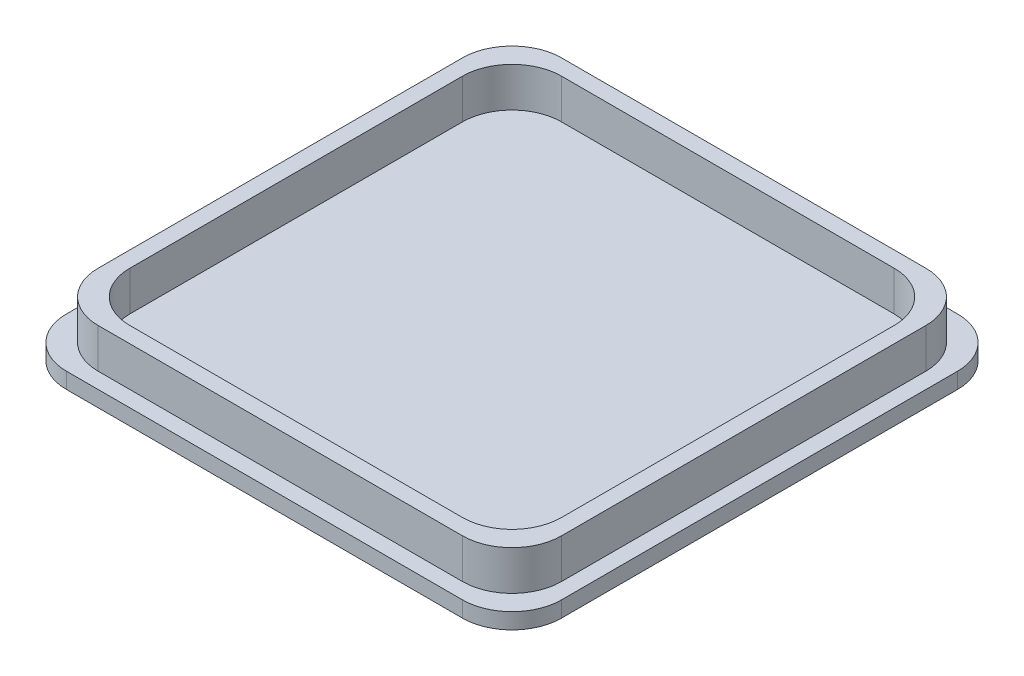
ISO-10303-21;
HEADER;
FILE_DESCRIPTION(('STEP AP214'),'2;1');
FILE_NAME('part.step','',(''),(''),'','','');
FILE_SCHEMA(('AUTOMOTIVE_DESIGN { 1 0 10303 214 1 1 1 1 }'));
ENDSEC;
DATA;
#1=APPLICATION_CONTEXT('core data for automotive mechanical design processes');
#2=APPLICATION_PROTOCOL_DEFINITION('international standard','automotive_design',2000,#1);
#3=PRODUCT_CONTEXT('',#1,'mechanical');
#4=PRODUCT('Part','Part','',(#3));
#5=PRODUCT_RELATED_PRODUCT_CATEGORY('part','',(#4));
#6=PRODUCT_DEFINITION_FORMATION('','',#4);
#7=PRODUCT_DEFINITION_CONTEXT('part definition',#1,'design');
#8=PRODUCT_DEFINITION('design','',#6,#7);
#9=PRODUCT_DEFINITION_SHAPE('','',#8);
#10=(LENGTH_UNIT() NAMED_UNIT(*) SI_UNIT(.MILLI.,.METRE.));
#11=(NAMED_UNIT(*) PLANE_ANGLE_UNIT() SI_UNIT($,.RADIAN.));
#12=(NAMED_UNIT(*) SI_UNIT($,.STERADIAN.) SOLID_ANGLE_UNIT());
#13=UNCERTAINTY_MEASURE_WITH_UNIT(LENGTH_MEASURE(1.E-05),#10,'distance_accuracy_value','');
#14=(GEOMETRIC_REPRESENTATION_CONTEXT(3) GLOBAL_UNCERTAINTY_ASSIGNED_CONTEXT((#13)) GLOBAL_UNIT_ASSIGNED_CONTEXT((#10,
#11,#12)) REPRESENTATION_CONTEXT('',''));
#15=CARTESIAN_POINT('',(0.,0.,0.));
#16=DIRECTION('',(0.,0.,1.));
#17=DIRECTION('',(1.,0.,0.));
#18=AXIS2_PLACEMENT_3D('',#15,#16,#17);
#19=CARTESIAN_POINT('',(0.,1.6,0.));
#20=DIRECTION('',(0.,-1.,0.));
#21=DIRECTION('',(0.,0.,-1.));
#22=AXIS2_PLACEMENT_3D('',#19,#20,#21);
#23=PLANE('',#22);
#24=DIRECTION('',(-1.,0.,0.));
#25=VECTOR('',#24,1.);
#26=CARTESIAN_POINT('',(-25.,1.6,-25.));
#27=LINE('',#26,#25);
#28=CARTESIAN_POINT('',(20.,1.6,-25.));
#29=VERTEX_POINT('',#28);
#30=CARTESIAN_POINT('',(-20.,1.6,-25.));
#31=VERTEX_POINT('',#30);
#32=EDGE_CURVE('E364',#29,#31,#27,.T.);
#33=ORIENTED_EDGE('',*,*,#32,.T.);
#34=CARTESIAN_POINT('',(-20.,1.6,-20.));
#35=DIRECTION('',(0.,-1.,0.));
#36=DIRECTION('',(0.,0.,-1.));
#37=AXIS2_PLACEMENT_3D('',#34,#35,#36);
#38=CIRCLE('',#37,5.);
#39=CARTESIAN_POINT('',(-25.,1.6,-20.));
#40=VERTEX_POINT('',#39);
#41=EDGE_CURVE('E248',#31,#40,#38,.F.);
#42=ORIENTED_EDGE('',*,*,#41,.T.);
#43=DIRECTION('',(0.,0.,1.));
#44=VECTOR('',#43,1.);
#45=CARTESIAN_POINT('',(-25.,1.6,25.));
#46=LINE('',#45,#44);
#47=CARTESIAN_POINT('',(-25.,1.6,20.));
#48=VERTEX_POINT('',#47);
#49=EDGE_CURVE('E217',#40,#48,#46,.T.);
#50=ORIENTED_EDGE('',*,*,#49,.T.);
#51=CARTESIAN_POINT('',(-20.,1.6,20.));
#52=DIRECTION('',(0.,-1.,0.));
#53=DIRECTION('',(0.,0.,-1.));
#54=AXIS2_PLACEMENT_3D('',#51,#52,#53);
#55=CIRCLE('',#54,5.);
#56=CARTESIAN_POINT('',(-20.,1.6,25.));
#57=VERTEX_POINT('',#56);
#58=EDGE_CURVE('E246',#48,#57,#55,.F.);
#59=ORIENTED_EDGE('',*,*,#58,.T.);
#60=DIRECTION('',(1.,0.,0.));
#61=VECTOR('',#60,1.);
#62=CARTESIAN_POINT('',(-25.,1.6,25.));
#63=LINE('',#62,#61);
#64=CARTESIAN_POINT('',(20.,1.6,25.));
#65=VERTEX_POINT('',#64);
#66=EDGE_CURVE('E233',#57,#65,#63,.T.);
#67=ORIENTED_EDGE('',*,*,#66,.T.);
#68=CARTESIAN_POINT('',(20.,1.6,20.));
#69=DIRECTION('',(0.,-1.,0.));
#70=DIRECTION('',(0.,0.,-1.));
#71=AXIS2_PLACEMENT_3D('',#68,#69,#70);
#72=CIRCLE('',#71,5.);
#73=CARTESIAN_POINT('',(25.,1.6,20.));
#74=VERTEX_POINT('',#73);
#75=EDGE_CURVE('E244',#65,#74,#72,.F.);
#76=ORIENTED_EDGE('',*,*,#75,.T.);
#77=DIRECTION('',(0.,0.,-1.));
#78=VECTOR('',#77,1.);
#79=CARTESIAN_POINT('',(25.,1.6,25.));
#80=LINE('',#79,#78);
#81=CARTESIAN_POINT('',(25.,1.6,-20.));
#82=VERTEX_POINT('',#81);
#83=EDGE_CURVE('E227',#74,#82,#80,.T.);
#84=ORIENTED_EDGE('',*,*,#83,.T.);
#85=CARTESIAN_POINT('',(20.,1.6,-20.));
#86=DIRECTION('',(0.,-1.,0.));
#87=DIRECTION('',(0.,0.,-1.));
#88=AXIS2_PLACEMENT_3D('',#85,#86,#87);
#89=CIRCLE('',#88,5.);
#90=EDGE_CURVE('E242',#82,#29,#89,.F.);
#91=ORIENTED_EDGE('',*,*,#90,.T.);
#92=EDGE_LOOP('',(#33,#42,#50,#59,#67,#76,#84,#91));
#93=FACE_BOUND('',#92,.T.);
#94=DIRECTION('',(1.,0.,0.));
#95=VECTOR('',#94,1.);
#96=CARTESIAN_POINT('',(-23.4,1.6,23.4));
#97=LINE('',#96,#95);
#98=CARTESIAN_POINT('',(-18.4,1.6,23.4));
#99=VERTEX_POINT('',#98);
#100=CARTESIAN_POINT('',(18.4,1.6,23.4));
#101=VERTEX_POINT('',#100);
#102=EDGE_CURVE('E329',#99,#101,#97,.T.);
#103=ORIENTED_EDGE('',*,*,#102,.F.);
#104=CARTESIAN_POINT('',(-18.4,1.6,18.4));
#105=DIRECTION('',(0.,-1.,0.));
#106=DIRECTION('',(0.,0.,-1.));
#107=AXIS2_PLACEMENT_3D('',#104,#105,#106);
#108=CIRCLE('',#107,5.);
#109=CARTESIAN_POINT('',(-23.4,1.6,18.4));
#110=VERTEX_POINT('',#109);
#111=EDGE_CURVE('E324',#99,#110,#108,.T.);
#112=ORIENTED_EDGE('',*,*,#111,.T.);
#113=DIRECTION('',(0.,0.,1.));
#114=VECTOR('',#113,1.);
#115=CARTESIAN_POINT('',(-23.4,1.6,-23.4));
#116=LINE('',#115,#114);
#117=CARTESIAN_POINT('',(-23.4,1.6,-18.4));
#118=VERTEX_POINT('',#117);
#119=EDGE_CURVE('E350',#118,#110,#116,.T.);
#120=ORIENTED_EDGE('',*,*,#119,.F.);
#121=CARTESIAN_POINT('',(-18.4,1.6,-18.4));
#122=DIRECTION('',(0.,-1.,0.));
#123=DIRECTION('',(0.,0.,-1.));
#124=AXIS2_PLACEMENT_3D('',#121,#122,#123);
#125=CIRCLE('',#124,5.);
#126=CARTESIAN_POINT('',(-18.4,1.6,-23.4));
#127=VERTEX_POINT('',#126);
#128=EDGE_CURVE('E320',#118,#127,#125,.T.);
#129=ORIENTED_EDGE('',*,*,#128,.T.);
#130=DIRECTION('',(-1.,0.,0.));
#131=VECTOR('',#130,1.);
#132=CARTESIAN_POINT('',(23.4,1.6,-23.4));
#133=LINE('',#132,#131);
#134=CARTESIAN_POINT('',(18.4,1.6,-23.4));
#135=VERTEX_POINT('',#134);
#136=EDGE_CURVE('E357',#135,#127,#133,.T.);
#137=ORIENTED_EDGE('',*,*,#136,.F.);
#138=CARTESIAN_POINT('',(18.4,1.6,-18.4));
#139=DIRECTION('',(0.,-1.,0.));
#140=DIRECTION('',(0.,0.,-1.));
#141=AXIS2_PLACEMENT_3D('',#138,#139,#140);
#142=CIRCLE('',#141,5.);
#143=CARTESIAN_POINT('',(23.4,1.6,-18.4));
#144=VERTEX_POINT('',#143);
#145=EDGE_CURVE('E322',#135,#144,#142,.T.);
#146=ORIENTED_EDGE('',*,*,#145,.T.);
#147=DIRECTION('',(0.,0.,-1.));
#148=VECTOR('',#147,1.);
#149=CARTESIAN_POINT('',(23.4,1.6,23.4));
#150=LINE('',#149,#148);
#151=CARTESIAN_POINT('',(23.4,1.6,18.4));
#152=VERTEX_POINT('',#151);
#153=EDGE_CURVE('E330',#152,#144,#150,.T.);
#154=ORIENTED_EDGE('',*,*,#153,.F.);
#155=CARTESIAN_POINT('',(18.4,1.6,18.4));
#156=DIRECTION('',(0.,-1.,0.));
#157=DIRECTION('',(0.,0.,-1.));
#158=AXIS2_PLACEMENT_3D('',#155,#156,#157);
#159=CIRCLE('',#158,5.);
#160=EDGE_CURVE('E43',#152,#101,#159,.T.);
#161=ORIENTED_EDGE('',*,*,#160,.T.);
#162=EDGE_LOOP('',(#103,#112,#120,#129,#137,#146,#154,#161));
#163=FACE_BOUND('',#162,.T.);
#164=ADVANCED_FACE('F35',(#93,#163),#23,.F.);
#165=CARTESIAN_POINT('',(25.,1.6,25.));
#166=DIRECTION('',(-1.,0.,0.));
#167=DIRECTION('',(0.,0.,1.));
#168=AXIS2_PLACEMENT_3D('',#165,#166,#167);
#169=PLANE('',#168);
#170=ORIENTED_EDGE('',*,*,#83,.F.);
#171=DIRECTION('',(0.,-1.,0.));
#172=VECTOR('',#171,1.);
#173=CARTESIAN_POINT('',(25.,1.6,20.));
#174=LINE('',#173,#172);
#175=CARTESIAN_POINT('',(25.,0.,20.));
#176=VERTEX_POINT('',#175);
#177=EDGE_CURVE('E302',#74,#176,#174,.T.);
#178=ORIENTED_EDGE('',*,*,#177,.T.);
#179=DIRECTION('',(0.,0.,-1.));
#180=VECTOR('',#179,1.);
#181=CARTESIAN_POINT('',(25.,0.,25.));
#182=LINE('',#181,#180);
#183=CARTESIAN_POINT('',(25.,0.,-20.));
#184=VERTEX_POINT('',#183);
#185=EDGE_CURVE('E229',#176,#184,#182,.T.);
#186=ORIENTED_EDGE('',*,*,#185,.T.);
#187=DIRECTION('',(0.,-1.,0.));
#188=VECTOR('',#187,1.);
#189=CARTESIAN_POINT('',(25.,1.6,-20.));
#190=LINE('',#189,#188);
#191=EDGE_CURVE('E300',#184,#82,#190,.F.);
#192=ORIENTED_EDGE('',*,*,#191,.T.);
#193=EDGE_LOOP('',(#170,#178,#186,#192));
#194=FACE_BOUND('',#193,.T.);
#195=ADVANCED_FACE('F374',(#194),#169,.F.);
#196=CARTESIAN_POINT('',(-25.,1.6,-25.));
#197=DIRECTION('',(0.,0.,1.));
#198=DIRECTION('',(1.,0.,0.));
#199=AXIS2_PLACEMENT_3D('',#196,#197,#198);
#200=PLANE('',#199);
#201=DIRECTION('',(-1.,0.,0.));
#202=VECTOR('',#201,1.);
#203=CARTESIAN_POINT('',(-25.,0.,-25.));
#204=LINE('',#203,#202);
#205=CARTESIAN_POINT('',(20.,0.,-25.));
#206=VERTEX_POINT('',#205);
#207=CARTESIAN_POINT('',(-20.,0.,-25.));
#208=VERTEX_POINT('',#207);
#209=EDGE_CURVE('E224',#206,#208,#204,.T.);
#210=ORIENTED_EDGE('',*,*,#209,.T.);
#211=DIRECTION('',(0.,-1.,0.));
#212=VECTOR('',#211,1.);
#213=CARTESIAN_POINT('',(-20.,1.6,-25.));
#214=LINE('',#213,#212);
#215=EDGE_CURVE('E202',#208,#31,#214,.F.);
#216=ORIENTED_EDGE('',*,*,#215,.T.);
#217=ORIENTED_EDGE('',*,*,#32,.F.);
#218=DIRECTION('',(0.,-1.,0.));
#219=VECTOR('',#218,1.);
#220=CARTESIAN_POINT('',(20.,1.6,-25.));
#221=LINE('',#220,#219);
#222=EDGE_CURVE('E207',#29,#206,#221,.T.);
#223=ORIENTED_EDGE('',*,*,#222,.T.);
#224=EDGE_LOOP('',(#210,#216,#217,#223));
#225=FACE_BOUND('',#224,.T.);
#226=ADVANCED_FACE('F383',(#225),#200,.F.);
#227=CARTESIAN_POINT('',(-25.,1.6,25.));
#228=DIRECTION('',(1.,0.,0.));
#229=DIRECTION('',(0.,0.,-1.));
#230=AXIS2_PLACEMENT_3D('',#227,#228,#229);
#231=PLANE('',#230);
#232=ORIENTED_EDGE('',*,*,#49,.F.);
#233=DIRECTION('',(0.,-1.,0.));
#234=VECTOR('',#233,1.);
#235=CARTESIAN_POINT('',(-25.,1.6,-20.));
#236=LINE('',#235,#234);
#237=CARTESIAN_POINT('',(-25.,0.,-20.));
#238=VERTEX_POINT('',#237);
#239=EDGE_CURVE('E201',#40,#238,#236,.T.);
#240=ORIENTED_EDGE('',*,*,#239,.T.);
#241=DIRECTION('',(0.,0.,1.));
#242=VECTOR('',#241,1.);
#243=CARTESIAN_POINT('',(-25.,0.,25.));
#244=LINE('',#243,#242);
#245=CARTESIAN_POINT('',(-25.,0.,20.));
#246=VERTEX_POINT('',#245);
#247=EDGE_CURVE('E214',#238,#246,#244,.T.);
#248=ORIENTED_EDGE('',*,*,#247,.T.);
#249=DIRECTION('',(0.,-1.,0.));
#250=VECTOR('',#249,1.);
#251=CARTESIAN_POINT('',(-25.,1.6,20.));
#252=LINE('',#251,#250);
#253=EDGE_CURVE('E219',#246,#48,#252,.F.);
#254=ORIENTED_EDGE('',*,*,#253,.T.);
#255=EDGE_LOOP('',(#232,#240,#248,#254));
#256=FACE_BOUND('',#255,.T.);
#257=ADVANCED_FACE('F213',(#256),#231,.F.);
#258=CARTESIAN_POINT('',(-25.,1.6,25.));
#259=DIRECTION('',(0.,0.,-1.));
#260=DIRECTION('',(-1.,0.,0.));
#261=AXIS2_PLACEMENT_3D('',#258,#259,#260);
#262=PLANE('',#261);
#263=ORIENTED_EDGE('',*,*,#66,.F.);
#264=DIRECTION('',(0.,-1.,0.));
#265=VECTOR('',#264,1.);
#266=CARTESIAN_POINT('',(-20.,1.6,25.));
#267=LINE('',#266,#265);
#268=CARTESIAN_POINT('',(-20.,0.,25.));
#269=VERTEX_POINT('',#268);
#270=EDGE_CURVE('E297',#57,#269,#267,.T.);
#271=ORIENTED_EDGE('',*,*,#270,.T.);
#272=DIRECTION('',(1.,0.,0.));
#273=VECTOR('',#272,1.);
#274=CARTESIAN_POINT('',(-25.,0.,25.));
#275=LINE('',#274,#273);
#276=CARTESIAN_POINT('',(20.,0.,25.));
#277=VERTEX_POINT('',#276);
#278=EDGE_CURVE('E223',#269,#277,#275,.T.);
#279=ORIENTED_EDGE('',*,*,#278,.T.);
#280=DIRECTION('',(0.,-1.,0.));
#281=VECTOR('',#280,1.);
#282=CARTESIAN_POINT('',(20.,1.6,25.));
#283=LINE('',#282,#281);
#284=EDGE_CURVE('E295',#277,#65,#283,.F.);
#285=ORIENTED_EDGE('',*,*,#284,.T.);
#286=EDGE_LOOP('',(#263,#271,#279,#285));
#287=FACE_BOUND('',#286,.T.);
#288=ADVANCED_FACE('F390',(#287),#262,.F.);
#289=CARTESIAN_POINT('',(0.,0.,0.));
#290=DIRECTION('',(0.,-1.,0.));
#291=DIRECTION('',(0.,0.,-1.));
#292=AXIS2_PLACEMENT_3D('',#289,#290,#291);
#293=PLANE('',#292);
#294=ORIENTED_EDGE('',*,*,#247,.F.);
#295=CARTESIAN_POINT('',(-20.,0.,-20.));
#296=DIRECTION('',(0.,-1.,0.));
#297=DIRECTION('',(0.,0.,-1.));
#298=AXIS2_PLACEMENT_3D('',#295,#296,#297);
#299=CIRCLE('',#298,5.);
#300=EDGE_CURVE('E197',#238,#208,#299,.T.);
#301=ORIENTED_EDGE('',*,*,#300,.T.);
#302=ORIENTED_EDGE('',*,*,#209,.F.);
#303=CARTESIAN_POINT('',(20.,0.,-20.));
#304=DIRECTION('',(0.,-1.,0.));
#305=DIRECTION('',(0.,0.,-1.));
#306=AXIS2_PLACEMENT_3D('',#303,#304,#305);
#307=CIRCLE('',#306,5.);
#308=EDGE_CURVE('E218',#206,#184,#307,.T.);
#309=ORIENTED_EDGE('',*,*,#308,.T.);
#310=ORIENTED_EDGE('',*,*,#185,.F.);
#311=CARTESIAN_POINT('',(20.,0.,20.));
#312=DIRECTION('',(0.,-1.,0.));
#313=DIRECTION('',(0.,0.,-1.));
#314=AXIS2_PLACEMENT_3D('',#311,#312,#313);
#315=CIRCLE('',#314,5.);
#316=EDGE_CURVE('E236',#176,#277,#315,.T.);
#317=ORIENTED_EDGE('',*,*,#316,.T.);
#318=ORIENTED_EDGE('',*,*,#278,.F.);
#319=CARTESIAN_POINT('',(-20.,0.,20.));
#320=DIRECTION('',(0.,-1.,0.));
#321=DIRECTION('',(0.,0.,-1.));
#322=AXIS2_PLACEMENT_3D('',#319,#320,#321);
#323=CIRCLE('',#322,5.);
#324=EDGE_CURVE('E208',#269,#246,#323,.T.);
#325=ORIENTED_EDGE('',*,*,#324,.T.);
#326=EDGE_LOOP('',(#294,#301,#302,#309,#310,#317,#318,#325));
#327=FACE_BOUND('',#326,.T.);
#328=ADVANCED_FACE('F221',(#327),#293,.T.);
#329=CARTESIAN_POINT('',(0.,5.6,0.));
#330=DIRECTION('',(0.,1.,0.));
#331=DIRECTION('',(0.,0.,1.));
#332=AXIS2_PLACEMENT_3D('',#329,#330,#331);
#333=PLANE('',#332);
#334=DIRECTION('',(-1.,0.,0.));
#335=VECTOR('',#334,1.);
#336=CARTESIAN_POINT('',(23.4,5.6,-23.4));
#337=LINE('',#336,#335);
#338=CARTESIAN_POINT('',(18.4,5.6,-23.4));
#339=VERTEX_POINT('',#338);
#340=CARTESIAN_POINT('',(-18.4,5.6,-23.4));
#341=VERTEX_POINT('',#340);
#342=EDGE_CURVE('E344',#339,#341,#337,.T.);
#343=ORIENTED_EDGE('',*,*,#342,.T.);
#344=CARTESIAN_POINT('',(-18.4,5.6,-18.4));
#345=DIRECTION('',(0.,1.,0.));
#346=DIRECTION('',(0.,0.,1.));
#347=AXIS2_PLACEMENT_3D('',#344,#345,#346);
#348=CIRCLE('',#347,5.);
#349=CARTESIAN_POINT('',(-23.4,5.6,-18.4));
#350=VERTEX_POINT('',#349);
#351=EDGE_CURVE('E293',#341,#350,#348,.T.);
#352=ORIENTED_EDGE('',*,*,#351,.T.);
#353=DIRECTION('',(0.,0.,1.));
#354=VECTOR('',#353,1.);
#355=CARTESIAN_POINT('',(-23.4,5.6,-23.4));
#356=LINE('',#355,#354);
#357=CARTESIAN_POINT('',(-23.4,5.6,18.4));
#358=VERTEX_POINT('',#357);
#359=EDGE_CURVE('E348',#350,#358,#356,.T.);
#360=ORIENTED_EDGE('',*,*,#359,.T.);
#361=CARTESIAN_POINT('',(-18.4,5.6,18.4));
#362=DIRECTION('',(0.,1.,0.));
#363=DIRECTION('',(0.,0.,1.));
#364=AXIS2_PLACEMENT_3D('',#361,#362,#363);
#365=CIRCLE('',#364,5.);
#366=CARTESIAN_POINT('',(-18.4,5.6,23.4));
#367=VERTEX_POINT('',#366);
#368=EDGE_CURVE('E289',#358,#367,#365,.T.);
#369=ORIENTED_EDGE('',*,*,#368,.T.);
#370=DIRECTION('',(1.,0.,0.));
#371=VECTOR('',#370,1.);
#372=CARTESIAN_POINT('',(-23.4,5.6,23.4));
#373=LINE('',#372,#371);
#374=CARTESIAN_POINT('',(18.4,5.6,23.4));
#375=VERTEX_POINT('',#374);
#376=EDGE_CURVE('E345',#367,#375,#373,.T.);
#377=ORIENTED_EDGE('',*,*,#376,.T.);
#378=CARTESIAN_POINT('',(18.4,5.6,18.4));
#379=DIRECTION('',(0.,1.,0.));
#380=DIRECTION('',(0.,0.,1.));
#381=AXIS2_PLACEMENT_3D('',#378,#379,#380);
#382=CIRCLE('',#381,5.);
#383=CARTESIAN_POINT('',(23.4,5.6,18.4));
#384=VERTEX_POINT('',#383);
#385=EDGE_CURVE('E57',#375,#384,#382,.T.);
#386=ORIENTED_EDGE('',*,*,#385,.T.);
#387=DIRECTION('',(0.,0.,-1.));
#388=VECTOR('',#387,1.);
#389=CARTESIAN_POINT('',(23.4,5.6,23.4));
#390=LINE('',#389,#388);
#391=CARTESIAN_POINT('',(23.4,5.6,-18.4));
#392=VERTEX_POINT('',#391);
#393=EDGE_CURVE('E342',#384,#392,#390,.T.);
#394=ORIENTED_EDGE('',*,*,#393,.T.);
#395=CARTESIAN_POINT('',(18.4,5.6,-18.4));
#396=DIRECTION('',(0.,1.,0.));
#397=DIRECTION('',(0.,0.,1.));
#398=AXIS2_PLACEMENT_3D('',#395,#396,#397);
#399=CIRCLE('',#398,5.);
#400=EDGE_CURVE('E291',#392,#339,#399,.T.);
#401=ORIENTED_EDGE('',*,*,#400,.T.);
#402=EDGE_LOOP('',(#343,#352,#360,#369,#377,#386,#394,#401));
#403=FACE_BOUND('',#402,.T.);
#404=DIRECTION('',(0.,0.,-1.));
#405=VECTOR('',#404,1.);
#406=CARTESIAN_POINT('',(21.8,5.6,21.8));
#407=LINE('',#406,#405);
#408=CARTESIAN_POINT('',(21.8,5.6,16.8));
#409=VERTEX_POINT('',#408);
#410=CARTESIAN_POINT('',(21.8,5.6,-16.8));
#411=VERTEX_POINT('',#410);
#412=EDGE_CURVE('E422',#409,#411,#407,.T.);
#413=ORIENTED_EDGE('',*,*,#412,.F.);
#414=CARTESIAN_POINT('',(16.8,5.6,16.8));
#415=DIRECTION('',(0.,1.,0.));
#416=DIRECTION('',(0.,0.,1.));
#417=AXIS2_PLACEMENT_3D('',#414,#415,#416);
#418=CIRCLE('',#417,5.);
#419=CARTESIAN_POINT('',(16.8,5.6,21.8));
#420=VERTEX_POINT('',#419);
#421=EDGE_CURVE('E316',#409,#420,#418,.F.);
#422=ORIENTED_EDGE('',*,*,#421,.T.);
#423=DIRECTION('',(1.,0.,0.));
#424=VECTOR('',#423,1.);
#425=CARTESIAN_POINT('',(-21.8,5.6,21.8));
#426=LINE('',#425,#424);
#427=CARTESIAN_POINT('',(-16.8,5.6,21.8));
#428=VERTEX_POINT('',#427);
#429=EDGE_CURVE('E419',#428,#420,#426,.T.);
#430=ORIENTED_EDGE('',*,*,#429,.F.);
#431=CARTESIAN_POINT('',(-16.8,5.6,16.8));
#432=DIRECTION('',(0.,1.,0.));
#433=DIRECTION('',(0.,0.,1.));
#434=AXIS2_PLACEMENT_3D('',#431,#432,#433);
#435=CIRCLE('',#434,5.);
#436=CARTESIAN_POINT('',(-21.8,5.6,16.8));
#437=VERTEX_POINT('',#436);
#438=EDGE_CURVE('E314',#428,#437,#435,.F.);
#439=ORIENTED_EDGE('',*,*,#438,.T.);
#440=DIRECTION('',(0.,0.,1.));
#441=VECTOR('',#440,1.);
#442=CARTESIAN_POINT('',(-21.8,5.6,-21.8));
#443=LINE('',#442,#441);
#444=CARTESIAN_POINT('',(-21.8,5.6,-16.8));
#445=VERTEX_POINT('',#444);
#446=EDGE_CURVE('E338',#445,#437,#443,.T.);
#447=ORIENTED_EDGE('',*,*,#446,.F.);
#448=CARTESIAN_POINT('',(-16.8,5.6,-16.8));
#449=DIRECTION('',(0.,1.,0.));
#450=DIRECTION('',(0.,0.,1.));
#451=AXIS2_PLACEMENT_3D('',#448,#449,#450);
#452=CIRCLE('',#451,5.);
#453=CARTESIAN_POINT('',(-16.8,5.6,-21.8));
#454=VERTEX_POINT('',#453);
#455=EDGE_CURVE('E11',#445,#454,#452,.F.);
#456=ORIENTED_EDGE('',*,*,#455,.T.);
#457=DIRECTION('',(-1.,0.,0.));
#458=VECTOR('',#457,1.);
#459=CARTESIAN_POINT('',(21.8,5.6,-21.8));
#460=LINE('',#459,#458);
#461=CARTESIAN_POINT('',(16.8,5.6,-21.8));
#462=VERTEX_POINT('',#461);
#463=EDGE_CURVE('E433',#462,#454,#460,.T.);
#464=ORIENTED_EDGE('',*,*,#463,.F.);
#465=CARTESIAN_POINT('',(16.8,5.6,-16.8));
#466=DIRECTION('',(0.,1.,0.));
#467=DIRECTION('',(0.,0.,1.));
#468=AXIS2_PLACEMENT_3D('',#465,#466,#467);
#469=CIRCLE('',#468,5.);
#470=EDGE_CURVE('E318',#462,#411,#469,.F.);
#471=ORIENTED_EDGE('',*,*,#470,.T.);
#472=EDGE_LOOP('',(#413,#422,#430,#439,#447,#456,#464,#471));
#473=FACE_BOUND('',#472,.T.);
#474=ADVANCED_FACE('F457',(#403,#473),#333,.T.);
#475=CARTESIAN_POINT('',(-23.4,5.6,23.4));
#476=DIRECTION('',(0.,0.,-1.));
#477=DIRECTION('',(-1.,0.,0.));
#478=AXIS2_PLACEMENT_3D('',#475,#476,#477);
#479=PLANE('',#478);
#480=ORIENTED_EDGE('',*,*,#376,.F.);
#481=DIRECTION('',(0.,-1.,0.));
#482=VECTOR('',#481,1.);
#483=CARTESIAN_POINT('',(-18.4,5.6,23.4));
#484=LINE('',#483,#482);
#485=EDGE_CURVE('E311',#367,#99,#484,.T.);
#486=ORIENTED_EDGE('',*,*,#485,.T.);
#487=ORIENTED_EDGE('',*,*,#102,.T.);
#488=DIRECTION('',(0.,-1.,0.));
#489=VECTOR('',#488,1.);
#490=CARTESIAN_POINT('',(18.4,5.6,23.4));
#491=LINE('',#490,#489);
#492=EDGE_CURVE('E309',#101,#375,#491,.F.);
#493=ORIENTED_EDGE('',*,*,#492,.T.);
#494=EDGE_LOOP('',(#480,#486,#487,#493));
#495=FACE_BOUND('',#494,.T.);
#496=ADVANCED_FACE('F336',(#495),#479,.F.);
#497=CARTESIAN_POINT('',(23.4,5.6,23.4));
#498=DIRECTION('',(-1.,0.,0.));
#499=DIRECTION('',(0.,0.,1.));
#500=AXIS2_PLACEMENT_3D('',#497,#498,#499);
#501=PLANE('',#500);
#502=ORIENTED_EDGE('',*,*,#153,.T.);
#503=DIRECTION('',(0.,-1.,0.));
#504=VECTOR('',#503,1.);
#505=CARTESIAN_POINT('',(23.4,5.6,-18.4));
#506=LINE('',#505,#504);
#507=EDGE_CURVE('E50',#144,#392,#506,.F.);
#508=ORIENTED_EDGE('',*,*,#507,.T.);
#509=ORIENTED_EDGE('',*,*,#393,.F.);
#510=DIRECTION('',(0.,-1.,0.));
#511=VECTOR('',#510,1.);
#512=CARTESIAN_POINT('',(23.4,5.6,18.4));
#513=LINE('',#512,#511);
#514=EDGE_CURVE('E305',#384,#152,#513,.T.);
#515=ORIENTED_EDGE('',*,*,#514,.T.);
#516=EDGE_LOOP('',(#502,#508,#509,#515));
#517=FACE_BOUND('',#516,.T.);
#518=ADVANCED_FACE('F341',(#517),#501,.F.);
#519=CARTESIAN_POINT('',(23.4,5.6,-23.4));
#520=DIRECTION('',(0.,0.,1.));
#521=DIRECTION('',(1.,0.,0.));
#522=AXIS2_PLACEMENT_3D('',#519,#520,#521);
#523=PLANE('',#522);
#524=ORIENTED_EDGE('',*,*,#136,.T.);
#525=DIRECTION('',(0.,-1.,0.));
#526=VECTOR('',#525,1.);
#527=CARTESIAN_POINT('',(-18.4,5.6,-23.4));
#528=LINE('',#527,#526);
#529=EDGE_CURVE('E286',#127,#341,#528,.F.);
#530=ORIENTED_EDGE('',*,*,#529,.T.);
#531=ORIENTED_EDGE('',*,*,#342,.F.);
#532=DIRECTION('',(0.,-1.,0.));
#533=VECTOR('',#532,1.);
#534=CARTESIAN_POINT('',(18.4,5.6,-23.4));
#535=LINE('',#534,#533);
#536=EDGE_CURVE('E283',#339,#135,#535,.T.);
#537=ORIENTED_EDGE('',*,*,#536,.T.);
#538=EDGE_LOOP('',(#524,#530,#531,#537));
#539=FACE_BOUND('',#538,.T.);
#540=ADVANCED_FACE('F611',(#539),#523,.F.);
#541=CARTESIAN_POINT('',(-23.4,5.6,-23.4));
#542=DIRECTION('',(1.,0.,0.));
#543=DIRECTION('',(0.,0.,-1.));
#544=AXIS2_PLACEMENT_3D('',#541,#542,#543);
#545=PLANE('',#544);
#546=ORIENTED_EDGE('',*,*,#359,.F.);
#547=DIRECTION('',(0.,-1.,0.));
#548=VECTOR('',#547,1.);
#549=CARTESIAN_POINT('',(-23.4,5.6,-18.4));
#550=LINE('',#549,#548);
#551=EDGE_CURVE('E280',#350,#118,#550,.T.);
#552=ORIENTED_EDGE('',*,*,#551,.T.);
#553=ORIENTED_EDGE('',*,*,#119,.T.);
#554=DIRECTION('',(0.,-1.,0.));
#555=VECTOR('',#554,1.);
#556=CARTESIAN_POINT('',(-23.4,5.6,18.4));
#557=LINE('',#556,#555);
#558=EDGE_CURVE('E278',#110,#358,#557,.F.);
#559=ORIENTED_EDGE('',*,*,#558,.T.);
#560=EDGE_LOOP('',(#546,#552,#553,#559));
#561=FACE_BOUND('',#560,.T.);
#562=ADVANCED_FACE('F602',(#561),#545,.F.);
#563=CARTESIAN_POINT('',(-21.8,5.6,21.8));
#564=DIRECTION('',(0.,0.,-1.));
#565=DIRECTION('',(-1.,0.,0.));
#566=AXIS2_PLACEMENT_3D('',#563,#564,#565);
#567=PLANE('',#566);
#568=DIRECTION('',(1.,0.,0.));
#569=VECTOR('',#568,1.);
#570=CARTESIAN_POINT('',(-21.8,1.6,21.8));
#571=LINE('',#570,#569);
#572=CARTESIAN_POINT('',(-16.8,1.6,21.8));
#573=VERTEX_POINT('',#572);
#574=CARTESIAN_POINT('',(16.8,1.6,21.8));
#575=VERTEX_POINT('',#574);
#576=EDGE_CURVE('E429',#573,#575,#571,.T.);
#577=ORIENTED_EDGE('',*,*,#576,.F.);
#578=DIRECTION('',(0.,-1.,0.));
#579=VECTOR('',#578,1.);
#580=CARTESIAN_POINT('',(-16.8,5.6,21.8));
#581=LINE('',#580,#579);
#582=EDGE_CURVE('E266',#573,#428,#581,.F.);
#583=ORIENTED_EDGE('',*,*,#582,.T.);
#584=ORIENTED_EDGE('',*,*,#429,.T.);
#585=DIRECTION('',(0.,-1.,0.));
#586=VECTOR('',#585,1.);
#587=CARTESIAN_POINT('',(16.8,1.6,21.8));
#588=LINE('',#587,#586);
#589=EDGE_CURVE('E263',#420,#575,#588,.T.);
#590=ORIENTED_EDGE('',*,*,#589,.T.);
#591=EDGE_LOOP('',(#577,#583,#584,#590));
#592=FACE_BOUND('',#591,.T.);
#593=ADVANCED_FACE('F463',(#592),#567,.T.);
#594=CARTESIAN_POINT('',(21.8,5.6,21.8));
#595=DIRECTION('',(-1.,0.,0.));
#596=DIRECTION('',(0.,0.,1.));
#597=AXIS2_PLACEMENT_3D('',#594,#595,#596);
#598=PLANE('',#597);
#599=DIRECTION('',(0.,0.,-1.));
#600=VECTOR('',#599,1.);
#601=CARTESIAN_POINT('',(21.8,1.6,21.8));
#602=LINE('',#601,#600);
#603=CARTESIAN_POINT('',(21.8,1.6,16.8));
#604=VERTEX_POINT('',#603);
#605=CARTESIAN_POINT('',(21.8,1.6,-16.8));
#606=VERTEX_POINT('',#605);
#607=EDGE_CURVE('E424',#604,#606,#602,.T.);
#608=ORIENTED_EDGE('',*,*,#607,.F.);
#609=DIRECTION('',(0.,-1.,0.));
#610=VECTOR('',#609,1.);
#611=CARTESIAN_POINT('',(21.8,5.6,16.8));
#612=LINE('',#611,#610);
#613=EDGE_CURVE('E271',#604,#409,#612,.F.);
#614=ORIENTED_EDGE('',*,*,#613,.T.);
#615=ORIENTED_EDGE('',*,*,#412,.T.);
#616=DIRECTION('',(0.,-1.,0.));
#617=VECTOR('',#616,1.);
#618=CARTESIAN_POINT('',(21.8,1.6,-16.8));
#619=LINE('',#618,#617);
#620=EDGE_CURVE('E268',#411,#606,#619,.T.);
#621=ORIENTED_EDGE('',*,*,#620,.T.);
#622=EDGE_LOOP('',(#608,#614,#615,#621));
#623=FACE_BOUND('',#622,.T.);
#624=ADVANCED_FACE('F441',(#623),#598,.T.);
#625=CARTESIAN_POINT('',(21.8,5.6,-21.8));
#626=DIRECTION('',(0.,0.,1.));
#627=DIRECTION('',(1.,0.,0.));
#628=AXIS2_PLACEMENT_3D('',#625,#626,#627);
#629=PLANE('',#628);
#630=DIRECTION('',(-1.,0.,0.));
#631=VECTOR('',#630,1.);
#632=CARTESIAN_POINT('',(21.8,1.6,-21.8));
#633=LINE('',#632,#631);
#634=CARTESIAN_POINT('',(16.8,1.6,-21.8));
#635=VERTEX_POINT('',#634);
#636=CARTESIAN_POINT('',(-16.8,1.6,-21.8));
#637=VERTEX_POINT('',#636);
#638=EDGE_CURVE('E420',#635,#637,#633,.T.);
#639=ORIENTED_EDGE('',*,*,#638,.F.);
#640=DIRECTION('',(0.,-1.,0.));
#641=VECTOR('',#640,1.);
#642=CARTESIAN_POINT('',(16.8,5.6,-21.8));
#643=LINE('',#642,#641);
#644=EDGE_CURVE('E276',#635,#462,#643,.F.);
#645=ORIENTED_EDGE('',*,*,#644,.T.);
#646=ORIENTED_EDGE('',*,*,#463,.T.);
#647=DIRECTION('',(0.,-1.,0.));
#648=VECTOR('',#647,1.);
#649=CARTESIAN_POINT('',(-16.8,1.6,-21.8));
#650=LINE('',#649,#648);
#651=EDGE_CURVE('E273',#454,#637,#650,.T.);
#652=ORIENTED_EDGE('',*,*,#651,.T.);
#653=EDGE_LOOP('',(#639,#645,#646,#652));
#654=FACE_BOUND('',#653,.T.);
#655=ADVANCED_FACE('F409',(#654),#629,.T.);
#656=CARTESIAN_POINT('',(-21.8,5.6,-21.8));
#657=DIRECTION('',(1.,0.,0.));
#658=DIRECTION('',(0.,0.,-1.));
#659=AXIS2_PLACEMENT_3D('',#656,#657,#658);
#660=PLANE('',#659);
#661=ORIENTED_EDGE('',*,*,#446,.T.);
#662=DIRECTION('',(0.,-1.,0.));
#663=VECTOR('',#662,1.);
#664=CARTESIAN_POINT('',(-21.8,1.6,16.8));
#665=LINE('',#664,#663);
#666=CARTESIAN_POINT('',(-21.8,1.6,16.8));
#667=VERTEX_POINT('',#666);
#668=EDGE_CURVE('E252',#437,#667,#665,.T.);
#669=ORIENTED_EDGE('',*,*,#668,.T.);
#670=DIRECTION('',(0.,0.,1.));
#671=VECTOR('',#670,1.);
#672=CARTESIAN_POINT('',(-21.8,1.6,-21.8));
#673=LINE('',#672,#671);
#674=CARTESIAN_POINT('',(-21.8,1.6,-16.8));
#675=VERTEX_POINT('',#674);
#676=EDGE_CURVE('E414',#675,#667,#673,.T.);
#677=ORIENTED_EDGE('',*,*,#676,.F.);
#678=DIRECTION('',(0.,-1.,0.));
#679=VECTOR('',#678,1.);
#680=CARTESIAN_POINT('',(-21.8,5.6,-16.8));
#681=LINE('',#680,#679);
#682=EDGE_CURVE('E250',#675,#445,#681,.F.);
#683=ORIENTED_EDGE('',*,*,#682,.T.);
#684=EDGE_LOOP('',(#661,#669,#677,#683));
#685=FACE_BOUND('',#684,.T.);
#686=ADVANCED_FACE('F401',(#685),#660,.T.);
#687=ORIENTED_EDGE('',*,*,#676,.T.);
#688=CARTESIAN_POINT('',(-16.8,1.6,16.8));
#689=DIRECTION('',(0.,-1.,0.));
#690=DIRECTION('',(0.,0.,-1.));
#691=AXIS2_PLACEMENT_3D('',#688,#689,#690);
#692=CIRCLE('',#691,5.);
#693=EDGE_CURVE('E261',#667,#573,#692,.F.);
#694=ORIENTED_EDGE('',*,*,#693,.T.);
#695=ORIENTED_EDGE('',*,*,#576,.T.);
#696=CARTESIAN_POINT('',(16.8,1.6,16.8));
#697=DIRECTION('',(0.,-1.,0.));
#698=DIRECTION('',(0.,0.,-1.));
#699=AXIS2_PLACEMENT_3D('',#696,#697,#698);
#700=CIRCLE('',#699,5.);
#701=EDGE_CURVE('E259',#575,#604,#700,.F.);
#702=ORIENTED_EDGE('',*,*,#701,.T.);
#703=ORIENTED_EDGE('',*,*,#607,.T.);
#704=CARTESIAN_POINT('',(16.8,1.6,-16.8));
#705=DIRECTION('',(0.,-1.,0.));
#706=DIRECTION('',(0.,0.,-1.));
#707=AXIS2_PLACEMENT_3D('',#704,#705,#706);
#708=CIRCLE('',#707,5.);
#709=EDGE_CURVE('E257',#606,#635,#708,.F.);
#710=ORIENTED_EDGE('',*,*,#709,.T.);
#711=ORIENTED_EDGE('',*,*,#638,.T.);
#712=CARTESIAN_POINT('',(-16.8,1.6,-16.8));
#713=DIRECTION('',(0.,-1.,0.));
#714=DIRECTION('',(0.,0.,-1.));
#715=AXIS2_PLACEMENT_3D('',#712,#713,#714);
#716=CIRCLE('',#715,5.);
#717=EDGE_CURVE('E255',#637,#675,#716,.F.);
#718=ORIENTED_EDGE('',*,*,#717,.T.);
#719=EDGE_LOOP('',(#687,#694,#695,#702,#703,#710,#711,#718));
#720=FACE_BOUND('',#719,.T.);
#721=ADVANCED_FACE('F395',(#720),#23,.F.);
#722=CARTESIAN_POINT('',(-20.,1.6,-20.));
#723=DIRECTION('',(0.,-1.,0.));
#724=DIRECTION('',(0.,0.,-1.));
#725=AXIS2_PLACEMENT_3D('',#722,#723,#724);
#726=CYLINDRICAL_SURFACE('',#725,5.);
#727=ORIENTED_EDGE('',*,*,#41,.F.);
#728=ORIENTED_EDGE('',*,*,#215,.F.);
#729=ORIENTED_EDGE('',*,*,#300,.F.);
#730=ORIENTED_EDGE('',*,*,#239,.F.);
#731=EDGE_LOOP('',(#727,#728,#729,#730));
#732=FACE_BOUND('',#731,.T.);
#733=ADVANCED_FACE('F200',(#732),#726,.T.);
#734=CARTESIAN_POINT('',(-16.8,5.6,16.8));
#735=DIRECTION('',(0.,1.,0.));
#736=DIRECTION('',(0.,0.,1.));
#737=AXIS2_PLACEMENT_3D('',#734,#735,#736);
#738=CYLINDRICAL_SURFACE('',#737,5.);
#739=ORIENTED_EDGE('',*,*,#438,.F.);
#740=ORIENTED_EDGE('',*,*,#582,.F.);
#741=ORIENTED_EDGE('',*,*,#693,.F.);
#742=ORIENTED_EDGE('',*,*,#668,.F.);
#743=EDGE_LOOP('',(#739,#740,#741,#742));
#744=FACE_BOUND('',#743,.T.);
#745=ADVANCED_FACE('F407',(#744),#738,.F.);
#746=CARTESIAN_POINT('',(16.8,5.6,16.8));
#747=DIRECTION('',(0.,1.,0.));
#748=DIRECTION('',(0.,0.,1.));
#749=AXIS2_PLACEMENT_3D('',#746,#747,#748);
#750=CYLINDRICAL_SURFACE('',#749,5.);
#751=ORIENTED_EDGE('',*,*,#421,.F.);
#752=ORIENTED_EDGE('',*,*,#613,.F.);
#753=ORIENTED_EDGE('',*,*,#701,.F.);
#754=ORIENTED_EDGE('',*,*,#589,.F.);
#755=EDGE_LOOP('',(#751,#752,#753,#754));
#756=FACE_BOUND('',#755,.T.);
#757=ADVANCED_FACE('F466',(#756),#750,.F.);
#758=CARTESIAN_POINT('',(16.8,5.6,-16.8));
#759=DIRECTION('',(0.,1.,0.));
#760=DIRECTION('',(0.,0.,1.));
#761=AXIS2_PLACEMENT_3D('',#758,#759,#760);
#762=CYLINDRICAL_SURFACE('',#761,5.);
#763=ORIENTED_EDGE('',*,*,#470,.F.);
#764=ORIENTED_EDGE('',*,*,#644,.F.);
#765=ORIENTED_EDGE('',*,*,#709,.F.);
#766=ORIENTED_EDGE('',*,*,#620,.F.);
#767=EDGE_LOOP('',(#763,#764,#765,#766));
#768=FACE_BOUND('',#767,.T.);
#769=ADVANCED_FACE('F447',(#768),#762,.F.);
#770=CARTESIAN_POINT('',(-18.4,5.6,-18.4));
#771=DIRECTION('',(0.,-1.,0.));
#772=DIRECTION('',(0.,0.,-1.));
#773=AXIS2_PLACEMENT_3D('',#770,#771,#772);
#774=CYLINDRICAL_SURFACE('',#773,5.);
#775=ORIENTED_EDGE('',*,*,#351,.F.);
#776=ORIENTED_EDGE('',*,*,#529,.F.);
#777=ORIENTED_EDGE('',*,*,#128,.F.);
#778=ORIENTED_EDGE('',*,*,#551,.F.);
#779=EDGE_LOOP('',(#775,#776,#777,#778));
#780=FACE_BOUND('',#779,.T.);
#781=ADVANCED_FACE('F473',(#780),#774,.T.);
#782=CARTESIAN_POINT('',(-20.,1.6,20.));
#783=DIRECTION('',(0.,-1.,0.));
#784=DIRECTION('',(0.,0.,-1.));
#785=AXIS2_PLACEMENT_3D('',#782,#783,#784);
#786=CYLINDRICAL_SURFACE('',#785,5.);
#787=ORIENTED_EDGE('',*,*,#58,.F.);
#788=ORIENTED_EDGE('',*,*,#253,.F.);
#789=ORIENTED_EDGE('',*,*,#324,.F.);
#790=ORIENTED_EDGE('',*,*,#270,.F.);
#791=EDGE_LOOP('',(#787,#788,#789,#790));
#792=FACE_BOUND('',#791,.T.);
#793=ADVANCED_FACE('F479',(#792),#786,.T.);
#794=CARTESIAN_POINT('',(20.,1.6,20.));
#795=DIRECTION('',(0.,-1.,0.));
#796=DIRECTION('',(0.,0.,-1.));
#797=AXIS2_PLACEMENT_3D('',#794,#795,#796);
#798=CYLINDRICAL_SURFACE('',#797,5.);
#799=ORIENTED_EDGE('',*,*,#75,.F.);
#800=ORIENTED_EDGE('',*,*,#284,.F.);
#801=ORIENTED_EDGE('',*,*,#316,.F.);
#802=ORIENTED_EDGE('',*,*,#177,.F.);
#803=EDGE_LOOP('',(#799,#800,#801,#802));
#804=FACE_BOUND('',#803,.T.);
#805=ADVANCED_FACE('F483',(#804),#798,.T.);
#806=CARTESIAN_POINT('',(20.,1.6,-20.));
#807=DIRECTION('',(0.,-1.,0.));
#808=DIRECTION('',(0.,0.,-1.));
#809=AXIS2_PLACEMENT_3D('',#806,#807,#808);
#810=CYLINDRICAL_SURFACE('',#809,5.);
#811=ORIENTED_EDGE('',*,*,#90,.F.);
#812=ORIENTED_EDGE('',*,*,#191,.F.);
#813=ORIENTED_EDGE('',*,*,#308,.F.);
#814=ORIENTED_EDGE('',*,*,#222,.F.);
#815=EDGE_LOOP('',(#811,#812,#813,#814));
#816=FACE_BOUND('',#815,.T.);
#817=ADVANCED_FACE('F378',(#816),#810,.T.);
#818=CARTESIAN_POINT('',(18.4,5.6,-18.4));
#819=DIRECTION('',(0.,-1.,0.));
#820=DIRECTION('',(0.,0.,-1.));
#821=AXIS2_PLACEMENT_3D('',#818,#819,#820);
#822=CYLINDRICAL_SURFACE('',#821,5.);
#823=ORIENTED_EDGE('',*,*,#400,.F.);
#824=ORIENTED_EDGE('',*,*,#507,.F.);
#825=ORIENTED_EDGE('',*,*,#145,.F.);
#826=ORIENTED_EDGE('',*,*,#536,.F.);
#827=EDGE_LOOP('',(#823,#824,#825,#826));
#828=FACE_BOUND('',#827,.T.);
#829=ADVANCED_FACE('F490',(#828),#822,.T.);
#830=CARTESIAN_POINT('',(-18.4,5.6,18.4));
#831=DIRECTION('',(0.,-1.,0.));
#832=DIRECTION('',(0.,0.,-1.));
#833=AXIS2_PLACEMENT_3D('',#830,#831,#832);
#834=CYLINDRICAL_SURFACE('',#833,5.);
#835=ORIENTED_EDGE('',*,*,#368,.F.);
#836=ORIENTED_EDGE('',*,*,#558,.F.);
#837=ORIENTED_EDGE('',*,*,#111,.F.);
#838=ORIENTED_EDGE('',*,*,#485,.F.);
#839=EDGE_LOOP('',(#835,#836,#837,#838));
#840=FACE_BOUND('',#839,.T.);
#841=ADVANCED_FACE('F493',(#840),#834,.T.);
#842=CARTESIAN_POINT('',(18.4,5.6,18.4));
#843=DIRECTION('',(0.,-1.,0.));
#844=DIRECTION('',(0.,0.,-1.));
#845=AXIS2_PLACEMENT_3D('',#842,#843,#844);
#846=CYLINDRICAL_SURFACE('',#845,5.);
#847=ORIENTED_EDGE('',*,*,#385,.F.);
#848=ORIENTED_EDGE('',*,*,#492,.F.);
#849=ORIENTED_EDGE('',*,*,#160,.F.);
#850=ORIENTED_EDGE('',*,*,#514,.F.);
#851=EDGE_LOOP('',(#847,#848,#849,#850));
#852=FACE_BOUND('',#851,.T.);
#853=ADVANCED_FACE('F340',(#852),#846,.T.);
#854=CARTESIAN_POINT('',(-16.8,5.6,-16.8));
#855=DIRECTION('',(0.,1.,0.));
#856=DIRECTION('',(0.,0.,1.));
#857=AXIS2_PLACEMENT_3D('',#854,#855,#856);
#858=CYLINDRICAL_SURFACE('',#857,5.);
#859=ORIENTED_EDGE('',*,*,#455,.F.);
#860=ORIENTED_EDGE('',*,*,#682,.F.);
#861=ORIENTED_EDGE('',*,*,#717,.F.);
#862=ORIENTED_EDGE('',*,*,#651,.F.);
#863=EDGE_LOOP('',(#859,#860,#861,#862));
#864=FACE_BOUND('',#863,.T.);
#865=ADVANCED_FACE('F37',(#864),#858,.F.);
#866=CLOSED_SHELL('',(#164,#195,#226,#257,#288,#328,#474,#496,#518,#540,#562,#593,#624,#655,
#686,#721,#733,#745,#757,#769,#781,#793,#805,#817,#829,#841,#853,#865));
#867=MANIFOLD_SOLID_BREP('B2',#866);
#868=ADVANCED_BREP_SHAPE_REPRESENTATION('',(#18,#867),#14);
#869=SHAPE_DEFINITION_REPRESENTATION(#9,#868);
ENDSEC;
END-ISO-10303-21;
